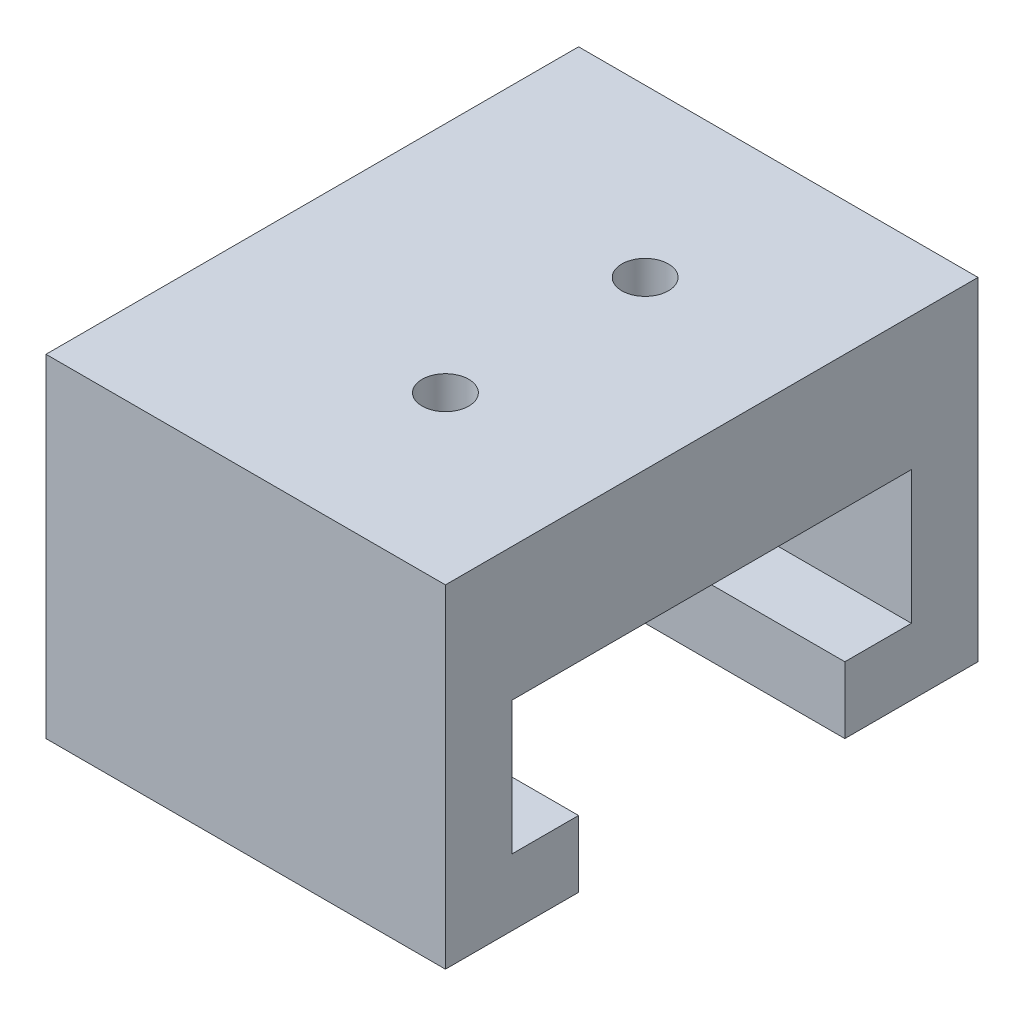
ISO-10303-21;
HEADER;
FILE_DESCRIPTION(('STEP AP214'),'2;1');
FILE_NAME('part.step','',(''),(''),'','','');
FILE_SCHEMA(('AUTOMOTIVE_DESIGN { 1 0 10303 214 1 1 1 1 }'));
ENDSEC;
DATA;
#1=APPLICATION_CONTEXT('core data for automotive mechanical design processes');
#2=APPLICATION_PROTOCOL_DEFINITION('international standard','automotive_design',2000,#1);
#3=PRODUCT_CONTEXT('',#1,'mechanical');
#4=PRODUCT('Part','Part','',(#3));
#5=PRODUCT_RELATED_PRODUCT_CATEGORY('part','',(#4));
#6=PRODUCT_DEFINITION_FORMATION('','',#4);
#7=PRODUCT_DEFINITION_CONTEXT('part definition',#1,'design');
#8=PRODUCT_DEFINITION('design','',#6,#7);
#9=PRODUCT_DEFINITION_SHAPE('','',#8);
#10=(LENGTH_UNIT() NAMED_UNIT(*) SI_UNIT(.MILLI.,.METRE.));
#11=(NAMED_UNIT(*) PLANE_ANGLE_UNIT() SI_UNIT($,.RADIAN.));
#12=(NAMED_UNIT(*) SI_UNIT($,.STERADIAN.) SOLID_ANGLE_UNIT());
#13=UNCERTAINTY_MEASURE_WITH_UNIT(LENGTH_MEASURE(1.E-05),#10,'distance_accuracy_value','');
#14=(GEOMETRIC_REPRESENTATION_CONTEXT(3) GLOBAL_UNCERTAINTY_ASSIGNED_CONTEXT((#13)) GLOBAL_UNIT_ASSIGNED_CONTEXT((#10,
#11,#12)) REPRESENTATION_CONTEXT('',''));
#15=CARTESIAN_POINT('',(0.,0.,0.));
#16=DIRECTION('',(0.,0.,1.));
#17=DIRECTION('',(1.,0.,0.));
#18=AXIS2_PLACEMENT_3D('',#15,#16,#17);
#19=CARTESIAN_POINT('',(-62.5,-133.,21.25));
#20=DIRECTION('',(0.,-1.,0.));
#21=DIRECTION('',(0.,0.,-1.));
#22=AXIS2_PLACEMENT_3D('',#19,#20,#21);
#23=CYLINDRICAL_SURFACE('',#22,1.75);
#24=CARTESIAN_POINT('',(-62.5,-150.,21.25));
#25=DIRECTION('',(0.,1.,0.));
#26=DIRECTION('',(0.,0.,1.));
#27=AXIS2_PLACEMENT_3D('',#24,#25,#26);
#28=CIRCLE('',#27,1.75);
#29=CARTESIAN_POINT('',(-62.5,-150.,23.));
#30=VERTEX_POINT('',#29);
#31=EDGE_CURVE('E160',#30,#30,#28,.T.);
#32=ORIENTED_EDGE('',*,*,#31,.T.);
#33=EDGE_LOOP('',(#32));
#34=FACE_BOUND('',#33,.T.);
#35=CARTESIAN_POINT('',(-62.5,-155.,21.25));
#36=DIRECTION('',(0.,-1.,0.));
#37=DIRECTION('',(0.,0.,-1.));
#38=AXIS2_PLACEMENT_3D('',#35,#36,#37);
#39=CIRCLE('',#38,1.75);
#40=CARTESIAN_POINT('',(-62.5,-155.,19.5));
#41=VERTEX_POINT('',#40);
#42=EDGE_CURVE('E47',#41,#41,#39,.F.);
#43=ORIENTED_EDGE('',*,*,#42,.F.);
#44=EDGE_LOOP('',(#43));
#45=FACE_BOUND('',#44,.T.);
#46=ADVANCED_FACE('F43',(#34,#45),#23,.F.);
#47=CARTESIAN_POINT('',(-62.5,-133.,36.2499999999999));
#48=DIRECTION('',(0.,-1.,0.));
#49=DIRECTION('',(0.,0.,-1.));
#50=AXIS2_PLACEMENT_3D('',#47,#48,#49);
#51=CYLINDRICAL_SURFACE('',#50,1.75);
#52=CARTESIAN_POINT('',(-62.5,-150.,36.2499999999999));
#53=DIRECTION('',(0.,1.,0.));
#54=DIRECTION('',(0.,0.,1.));
#55=AXIS2_PLACEMENT_3D('',#52,#53,#54);
#56=CIRCLE('',#55,1.75);
#57=CARTESIAN_POINT('',(-62.5,-150.,37.9999999999999));
#58=VERTEX_POINT('',#57);
#59=EDGE_CURVE('E177',#58,#58,#56,.T.);
#60=ORIENTED_EDGE('',*,*,#59,.T.);
#61=EDGE_LOOP('',(#60));
#62=FACE_BOUND('',#61,.T.);
#63=CARTESIAN_POINT('',(-62.5,-155.,36.2499999999999));
#64=DIRECTION('',(0.,-1.,0.));
#65=DIRECTION('',(0.,0.,-1.));
#66=AXIS2_PLACEMENT_3D('',#63,#64,#65);
#67=CIRCLE('',#66,1.75);
#68=CARTESIAN_POINT('',(-62.5,-155.,34.4999999999999));
#69=VERTEX_POINT('',#68);
#70=EDGE_CURVE('E154',#69,#69,#67,.F.);
#71=ORIENTED_EDGE('',*,*,#70,.F.);
#72=EDGE_LOOP('',(#71));
#73=FACE_BOUND('',#72,.T.);
#74=ADVANCED_FACE('F275',(#62,#73),#51,.F.);
#75=CARTESIAN_POINT('',(-75.,-150.,8.74999999999997));
#76=DIRECTION('',(0.,1.,0.));
#77=DIRECTION('',(0.,0.,1.));
#78=AXIS2_PLACEMENT_3D('',#75,#76,#77);
#79=PLANE('',#78);
#80=ORIENTED_EDGE('',*,*,#59,.F.);
#81=EDGE_LOOP('',(#80));
#82=FACE_BOUND('',#81,.T.);
#83=ORIENTED_EDGE('',*,*,#31,.F.);
#84=EDGE_LOOP('',(#83));
#85=FACE_BOUND('',#84,.T.);
#86=DIRECTION('',(0.,0.,1.));
#87=VECTOR('',#86,1.);
#88=CARTESIAN_POINT('',(-50.,-150.,8.74999999999997));
#89=LINE('',#88,#87);
#90=CARTESIAN_POINT('',(-50.,-150.,8.74999999999997));
#91=VERTEX_POINT('',#90);
#92=CARTESIAN_POINT('',(-50.,-150.,48.75));
#93=VERTEX_POINT('',#92);
#94=EDGE_CURVE('E190',#91,#93,#89,.T.);
#95=ORIENTED_EDGE('',*,*,#94,.F.);
#96=DIRECTION('',(1.,0.,0.));
#97=VECTOR('',#96,1.);
#98=CARTESIAN_POINT('',(-75.,-150.,8.74999999999997));
#99=LINE('',#98,#97);
#100=CARTESIAN_POINT('',(-80.,-150.,8.74999999999997));
#101=VERTEX_POINT('',#100);
#102=EDGE_CURVE('E11',#101,#91,#99,.T.);
#103=ORIENTED_EDGE('',*,*,#102,.F.);
#104=DIRECTION('',(0.,0.,-1.));
#105=VECTOR('',#104,1.);
#106=CARTESIAN_POINT('',(-80.,-150.,48.75));
#107=LINE('',#106,#105);
#108=CARTESIAN_POINT('',(-80.,-150.,48.75));
#109=VERTEX_POINT('',#108);
#110=EDGE_CURVE('E184',#109,#101,#107,.T.);
#111=ORIENTED_EDGE('',*,*,#110,.F.);
#112=DIRECTION('',(1.,0.,0.));
#113=VECTOR('',#112,1.);
#114=CARTESIAN_POINT('',(-75.,-150.,48.75));
#115=LINE('',#114,#113);
#116=EDGE_CURVE('E152',#109,#93,#115,.T.);
#117=ORIENTED_EDGE('',*,*,#116,.T.);
#118=EDGE_LOOP('',(#95,#103,#111,#117));
#119=FACE_BOUND('',#118,.T.);
#120=ADVANCED_FACE('F45',(#82,#85,#119),#79,.T.);
#121=CARTESIAN_POINT('',(-75.,-175.,8.74999999999997));
#122=DIRECTION('',(0.,0.,-1.));
#123=DIRECTION('',(-1.,0.,0.));
#124=AXIS2_PLACEMENT_3D('',#121,#122,#123);
#125=PLANE('',#124);
#126=DIRECTION('',(0.,1.,0.));
#127=VECTOR('',#126,1.);
#128=CARTESIAN_POINT('',(-50.,-175.,8.74999999999997));
#129=LINE('',#128,#127);
#130=CARTESIAN_POINT('',(-50.,-175.,8.74999999999997));
#131=VERTEX_POINT('',#130);
#132=EDGE_CURVE('E121',#131,#91,#129,.T.);
#133=ORIENTED_EDGE('',*,*,#132,.F.);
#134=DIRECTION('',(1.,0.,0.));
#135=VECTOR('',#134,1.);
#136=CARTESIAN_POINT('',(-75.,-175.,8.74999999999997));
#137=LINE('',#136,#135);
#138=CARTESIAN_POINT('',(-80.,-175.,8.74999999999997));
#139=VERTEX_POINT('',#138);
#140=EDGE_CURVE('E53',#139,#131,#137,.T.);
#141=ORIENTED_EDGE('',*,*,#140,.F.);
#142=DIRECTION('',(0.,-1.,0.));
#143=VECTOR('',#142,1.);
#144=CARTESIAN_POINT('',(-80.,-175.,8.74999999999997));
#145=LINE('',#144,#143);
#146=EDGE_CURVE('E187',#101,#139,#145,.T.);
#147=ORIENTED_EDGE('',*,*,#146,.F.);
#148=ORIENTED_EDGE('',*,*,#102,.T.);
#149=EDGE_LOOP('',(#133,#141,#147,#148));
#150=FACE_BOUND('',#149,.T.);
#151=ADVANCED_FACE('F126',(#150),#125,.T.);
#152=CARTESIAN_POINT('',(-75.,-175.,18.75));
#153=DIRECTION('',(0.,-1.,0.));
#154=DIRECTION('',(0.,0.,-1.));
#155=AXIS2_PLACEMENT_3D('',#152,#153,#154);
#156=PLANE('',#155);
#157=DIRECTION('',(0.,0.,-1.));
#158=VECTOR('',#157,1.);
#159=CARTESIAN_POINT('',(-50.,-175.,18.75));
#160=LINE('',#159,#158);
#161=CARTESIAN_POINT('',(-50.,-175.,18.75));
#162=VERTEX_POINT('',#161);
#163=EDGE_CURVE('E105',#162,#131,#160,.T.);
#164=ORIENTED_EDGE('',*,*,#163,.F.);
#165=DIRECTION('',(1.,0.,0.));
#166=VECTOR('',#165,1.);
#167=CARTESIAN_POINT('',(-75.,-175.,18.75));
#168=LINE('',#167,#166);
#169=CARTESIAN_POINT('',(-75.,-175.,18.75));
#170=VERTEX_POINT('',#169);
#171=EDGE_CURVE('E115',#170,#162,#168,.T.);
#172=ORIENTED_EDGE('',*,*,#171,.F.);
#173=DIRECTION('',(0.,0.,1.));
#174=VECTOR('',#173,1.);
#175=CARTESIAN_POINT('',(-75.,-175.,48.75));
#176=LINE('',#175,#174);
#177=CARTESIAN_POINT('',(-75.,-175.,38.75));
#178=VERTEX_POINT('',#177);
#179=EDGE_CURVE('E180',#170,#178,#176,.T.);
#180=ORIENTED_EDGE('',*,*,#179,.T.);
#181=DIRECTION('',(1.,0.,0.));
#182=VECTOR('',#181,1.);
#183=CARTESIAN_POINT('',(-75.,-175.,38.75));
#184=LINE('',#183,#182);
#185=CARTESIAN_POINT('',(-50.,-175.,38.75));
#186=VERTEX_POINT('',#185);
#187=EDGE_CURVE('E148',#178,#186,#184,.T.);
#188=ORIENTED_EDGE('',*,*,#187,.T.);
#189=DIRECTION('',(0.,0.,-1.));
#190=VECTOR('',#189,1.);
#191=CARTESIAN_POINT('',(-50.,-175.,48.75));
#192=LINE('',#191,#190);
#193=CARTESIAN_POINT('',(-50.,-175.,48.75));
#194=VERTEX_POINT('',#193);
#195=EDGE_CURVE('E212',#194,#186,#192,.T.);
#196=ORIENTED_EDGE('',*,*,#195,.F.);
#197=DIRECTION('',(1.,0.,0.));
#198=VECTOR('',#197,1.);
#199=CARTESIAN_POINT('',(-75.,-175.,48.75));
#200=LINE('',#199,#198);
#201=CARTESIAN_POINT('',(-80.,-175.,48.75));
#202=VERTEX_POINT('',#201);
#203=EDGE_CURVE('E150',#202,#194,#200,.T.);
#204=ORIENTED_EDGE('',*,*,#203,.F.);
#205=DIRECTION('',(0.,0.,1.));
#206=VECTOR('',#205,1.);
#207=CARTESIAN_POINT('',(-80.,-175.,48.75));
#208=LINE('',#207,#206);
#209=EDGE_CURVE('E110',#139,#202,#208,.T.);
#210=ORIENTED_EDGE('',*,*,#209,.F.);
#211=ORIENTED_EDGE('',*,*,#140,.T.);
#212=EDGE_LOOP('',(#164,#172,#180,#188,#196,#204,#210,#211));
#213=FACE_BOUND('',#212,.T.);
#214=ADVANCED_FACE('F103',(#213),#156,.T.);
#215=CARTESIAN_POINT('',(-75.,-170.,18.75));
#216=DIRECTION('',(0.,0.,1.));
#217=DIRECTION('',(1.,0.,0.));
#218=AXIS2_PLACEMENT_3D('',#215,#216,#217);
#219=PLANE('',#218);
#220=DIRECTION('',(0.,-1.,0.));
#221=VECTOR('',#220,1.);
#222=CARTESIAN_POINT('',(-50.,-170.,18.75));
#223=LINE('',#222,#221);
#224=CARTESIAN_POINT('',(-50.,-170.,18.75));
#225=VERTEX_POINT('',#224);
#226=EDGE_CURVE('E124',#225,#162,#223,.T.);
#227=ORIENTED_EDGE('',*,*,#226,.F.);
#228=DIRECTION('',(1.,0.,0.));
#229=VECTOR('',#228,1.);
#230=CARTESIAN_POINT('',(-75.,-170.,18.75));
#231=LINE('',#230,#229);
#232=CARTESIAN_POINT('',(-75.,-170.,18.75));
#233=VERTEX_POINT('',#232);
#234=EDGE_CURVE('E136',#233,#225,#231,.T.);
#235=ORIENTED_EDGE('',*,*,#234,.F.);
#236=DIRECTION('',(0.,-1.,0.));
#237=VECTOR('',#236,1.);
#238=CARTESIAN_POINT('',(-75.,-170.,18.75));
#239=LINE('',#238,#237);
#240=EDGE_CURVE('E153',#233,#170,#239,.T.);
#241=ORIENTED_EDGE('',*,*,#240,.T.);
#242=ORIENTED_EDGE('',*,*,#171,.T.);
#243=EDGE_LOOP('',(#227,#235,#241,#242));
#244=FACE_BOUND('',#243,.T.);
#245=ADVANCED_FACE('F240',(#244),#219,.T.);
#246=CARTESIAN_POINT('',(-75.,-170.,13.75));
#247=DIRECTION('',(0.,1.,0.));
#248=DIRECTION('',(0.,0.,1.));
#249=AXIS2_PLACEMENT_3D('',#246,#247,#248);
#250=PLANE('',#249);
#251=DIRECTION('',(0.,0.,1.));
#252=VECTOR('',#251,1.);
#253=CARTESIAN_POINT('',(-50.,-170.,13.75));
#254=LINE('',#253,#252);
#255=CARTESIAN_POINT('',(-50.,-170.,13.75));
#256=VERTEX_POINT('',#255);
#257=EDGE_CURVE('E230',#256,#225,#254,.T.);
#258=ORIENTED_EDGE('',*,*,#257,.F.);
#259=DIRECTION('',(1.,0.,0.));
#260=VECTOR('',#259,1.);
#261=CARTESIAN_POINT('',(-75.,-170.,13.75));
#262=LINE('',#261,#260);
#263=CARTESIAN_POINT('',(-75.,-170.,13.75));
#264=VERTEX_POINT('',#263);
#265=EDGE_CURVE('E138',#264,#256,#262,.T.);
#266=ORIENTED_EDGE('',*,*,#265,.F.);
#267=DIRECTION('',(0.,0.,1.));
#268=VECTOR('',#267,1.);
#269=CARTESIAN_POINT('',(-75.,-170.,13.75));
#270=LINE('',#269,#268);
#271=EDGE_CURVE('E203',#264,#233,#270,.T.);
#272=ORIENTED_EDGE('',*,*,#271,.T.);
#273=ORIENTED_EDGE('',*,*,#234,.T.);
#274=EDGE_LOOP('',(#258,#266,#272,#273));
#275=FACE_BOUND('',#274,.T.);
#276=ADVANCED_FACE('F235',(#275),#250,.T.);
#277=CARTESIAN_POINT('',(-75.,-160.,13.75));
#278=DIRECTION('',(0.,0.,1.));
#279=DIRECTION('',(0.,-1.,0.));
#280=AXIS2_PLACEMENT_3D('',#277,#278,#279);
#281=PLANE('',#280);
#282=DIRECTION('',(0.,-1.,0.));
#283=VECTOR('',#282,1.);
#284=CARTESIAN_POINT('',(-50.,-160.,13.75));
#285=LINE('',#284,#283);
#286=CARTESIAN_POINT('',(-50.,-160.,13.75));
#287=VERTEX_POINT('',#286);
#288=EDGE_CURVE('E227',#287,#256,#285,.T.);
#289=ORIENTED_EDGE('',*,*,#288,.F.);
#290=DIRECTION('',(1.,0.,0.));
#291=VECTOR('',#290,1.);
#292=CARTESIAN_POINT('',(-75.,-160.,13.75));
#293=LINE('',#292,#291);
#294=CARTESIAN_POINT('',(-75.,-160.,13.75));
#295=VERTEX_POINT('',#294);
#296=EDGE_CURVE('E140',#295,#287,#293,.T.);
#297=ORIENTED_EDGE('',*,*,#296,.F.);
#298=DIRECTION('',(0.,-1.,0.));
#299=VECTOR('',#298,1.);
#300=CARTESIAN_POINT('',(-75.,-160.,13.75));
#301=LINE('',#300,#299);
#302=EDGE_CURVE('E200',#295,#264,#301,.T.);
#303=ORIENTED_EDGE('',*,*,#302,.T.);
#304=ORIENTED_EDGE('',*,*,#265,.T.);
#305=EDGE_LOOP('',(#289,#297,#303,#304));
#306=FACE_BOUND('',#305,.T.);
#307=ADVANCED_FACE('F306',(#306),#281,.T.);
#308=CARTESIAN_POINT('',(-75.,-160.,43.75));
#309=DIRECTION('',(0.,-1.,0.));
#310=DIRECTION('',(0.,0.,-1.));
#311=AXIS2_PLACEMENT_3D('',#308,#309,#310);
#312=PLANE('',#311);
#313=CARTESIAN_POINT('',(-62.5,-160.,36.2499999999999));
#314=DIRECTION('',(0.,-1.,0.));
#315=DIRECTION('',(0.,0.,-1.));
#316=AXIS2_PLACEMENT_3D('',#313,#314,#315);
#317=CIRCLE('',#316,2.5);
#318=CARTESIAN_POINT('',(-62.5,-160.,33.7499999999999));
#319=VERTEX_POINT('',#318);
#320=EDGE_CURVE('E162',#319,#319,#317,.T.);
#321=ORIENTED_EDGE('',*,*,#320,.F.);
#322=EDGE_LOOP('',(#321));
#323=FACE_BOUND('',#322,.T.);
#324=CARTESIAN_POINT('',(-62.5,-160.,21.25));
#325=DIRECTION('',(0.,-1.,0.));
#326=DIRECTION('',(0.,0.,-1.));
#327=AXIS2_PLACEMENT_3D('',#324,#325,#326);
#328=CIRCLE('',#327,2.5);
#329=CARTESIAN_POINT('',(-62.5,-160.,18.75));
#330=VERTEX_POINT('',#329);
#331=EDGE_CURVE('E167',#330,#330,#328,.T.);
#332=ORIENTED_EDGE('',*,*,#331,.F.);
#333=EDGE_LOOP('',(#332));
#334=FACE_BOUND('',#333,.T.);
#335=DIRECTION('',(0.,0.,-1.));
#336=VECTOR('',#335,1.);
#337=CARTESIAN_POINT('',(-50.,-160.,43.75));
#338=LINE('',#337,#336);
#339=CARTESIAN_POINT('',(-50.,-160.,43.75));
#340=VERTEX_POINT('',#339);
#341=EDGE_CURVE('E224',#340,#287,#338,.T.);
#342=ORIENTED_EDGE('',*,*,#341,.F.);
#343=DIRECTION('',(1.,0.,0.));
#344=VECTOR('',#343,1.);
#345=CARTESIAN_POINT('',(-75.,-160.,43.75));
#346=LINE('',#345,#344);
#347=CARTESIAN_POINT('',(-75.,-160.,43.75));
#348=VERTEX_POINT('',#347);
#349=EDGE_CURVE('E142',#348,#340,#346,.T.);
#350=ORIENTED_EDGE('',*,*,#349,.F.);
#351=DIRECTION('',(0.,0.,-1.));
#352=VECTOR('',#351,1.);
#353=CARTESIAN_POINT('',(-75.,-160.,43.75));
#354=LINE('',#353,#352);
#355=EDGE_CURVE('E197',#348,#295,#354,.T.);
#356=ORIENTED_EDGE('',*,*,#355,.T.);
#357=ORIENTED_EDGE('',*,*,#296,.T.);
#358=EDGE_LOOP('',(#342,#350,#356,#357));
#359=FACE_BOUND('',#358,.T.);
#360=ADVANCED_FACE('F302',(#323,#334,#359),#312,.T.);
#361=CARTESIAN_POINT('',(-75.,-170.,43.75));
#362=DIRECTION('',(0.,0.,-1.));
#363=DIRECTION('',(-1.,0.,0.));
#364=AXIS2_PLACEMENT_3D('',#361,#362,#363);
#365=PLANE('',#364);
#366=DIRECTION('',(0.,1.,0.));
#367=VECTOR('',#366,1.);
#368=CARTESIAN_POINT('',(-50.,-170.,43.75));
#369=LINE('',#368,#367);
#370=CARTESIAN_POINT('',(-50.,-170.,43.75));
#371=VERTEX_POINT('',#370);
#372=EDGE_CURVE('E221',#371,#340,#369,.T.);
#373=ORIENTED_EDGE('',*,*,#372,.F.);
#374=DIRECTION('',(1.,0.,0.));
#375=VECTOR('',#374,1.);
#376=CARTESIAN_POINT('',(-75.,-170.,43.75));
#377=LINE('',#376,#375);
#378=CARTESIAN_POINT('',(-75.,-170.,43.75));
#379=VERTEX_POINT('',#378);
#380=EDGE_CURVE('E144',#379,#371,#377,.T.);
#381=ORIENTED_EDGE('',*,*,#380,.F.);
#382=DIRECTION('',(0.,1.,0.));
#383=VECTOR('',#382,1.);
#384=CARTESIAN_POINT('',(-75.,-170.,43.75));
#385=LINE('',#384,#383);
#386=EDGE_CURVE('E194',#379,#348,#385,.T.);
#387=ORIENTED_EDGE('',*,*,#386,.T.);
#388=ORIENTED_EDGE('',*,*,#349,.T.);
#389=EDGE_LOOP('',(#373,#381,#387,#388));
#390=FACE_BOUND('',#389,.T.);
#391=ADVANCED_FACE('F305',(#390),#365,.T.);
#392=CARTESIAN_POINT('',(-75.,-170.,38.75));
#393=DIRECTION('',(0.,1.,0.));
#394=DIRECTION('',(0.,0.,1.));
#395=AXIS2_PLACEMENT_3D('',#392,#393,#394);
#396=PLANE('',#395);
#397=DIRECTION('',(0.,0.,1.));
#398=VECTOR('',#397,1.);
#399=CARTESIAN_POINT('',(-50.,-170.,38.75));
#400=LINE('',#399,#398);
#401=CARTESIAN_POINT('',(-50.,-170.,38.75));
#402=VERTEX_POINT('',#401);
#403=EDGE_CURVE('E218',#402,#371,#400,.T.);
#404=ORIENTED_EDGE('',*,*,#403,.F.);
#405=DIRECTION('',(1.,0.,0.));
#406=VECTOR('',#405,1.);
#407=CARTESIAN_POINT('',(-75.,-170.,38.75));
#408=LINE('',#407,#406);
#409=CARTESIAN_POINT('',(-75.,-170.,38.75));
#410=VERTEX_POINT('',#409);
#411=EDGE_CURVE('E146',#410,#402,#408,.T.);
#412=ORIENTED_EDGE('',*,*,#411,.F.);
#413=DIRECTION('',(0.,0.,1.));
#414=VECTOR('',#413,1.);
#415=CARTESIAN_POINT('',(-75.,-170.,38.75));
#416=LINE('',#415,#414);
#417=EDGE_CURVE('E61',#410,#379,#416,.T.);
#418=ORIENTED_EDGE('',*,*,#417,.T.);
#419=ORIENTED_EDGE('',*,*,#380,.T.);
#420=EDGE_LOOP('',(#404,#412,#418,#419));
#421=FACE_BOUND('',#420,.T.);
#422=ADVANCED_FACE('F329',(#421),#396,.T.);
#423=CARTESIAN_POINT('',(-75.,-175.,38.75));
#424=DIRECTION('',(0.,0.,-1.));
#425=DIRECTION('',(-1.,0.,0.));
#426=AXIS2_PLACEMENT_3D('',#423,#424,#425);
#427=PLANE('',#426);
#428=DIRECTION('',(0.,1.,0.));
#429=VECTOR('',#428,1.);
#430=CARTESIAN_POINT('',(-50.,-175.,38.75));
#431=LINE('',#430,#429);
#432=EDGE_CURVE('E215',#186,#402,#431,.T.);
#433=ORIENTED_EDGE('',*,*,#432,.F.);
#434=ORIENTED_EDGE('',*,*,#187,.F.);
#435=DIRECTION('',(0.,1.,0.));
#436=VECTOR('',#435,1.);
#437=CARTESIAN_POINT('',(-75.,-175.,38.75));
#438=LINE('',#437,#436);
#439=EDGE_CURVE('E129',#178,#410,#438,.T.);
#440=ORIENTED_EDGE('',*,*,#439,.T.);
#441=ORIENTED_EDGE('',*,*,#411,.T.);
#442=EDGE_LOOP('',(#433,#434,#440,#441));
#443=FACE_BOUND('',#442,.T.);
#444=ADVANCED_FACE('F332',(#443),#427,.T.);
#445=CARTESIAN_POINT('',(-75.,-150.,48.75));
#446=DIRECTION('',(0.,0.,1.));
#447=DIRECTION('',(1.,0.,0.));
#448=AXIS2_PLACEMENT_3D('',#445,#446,#447);
#449=PLANE('',#448);
#450=DIRECTION('',(0.,-1.,0.));
#451=VECTOR('',#450,1.);
#452=CARTESIAN_POINT('',(-50.,-150.,48.75));
#453=LINE('',#452,#451);
#454=EDGE_CURVE('E209',#93,#194,#453,.T.);
#455=ORIENTED_EDGE('',*,*,#454,.F.);
#456=ORIENTED_EDGE('',*,*,#116,.F.);
#457=DIRECTION('',(0.,1.,0.));
#458=VECTOR('',#457,1.);
#459=CARTESIAN_POINT('',(-80.,-175.,48.75));
#460=LINE('',#459,#458);
#461=EDGE_CURVE('E181',#202,#109,#460,.T.);
#462=ORIENTED_EDGE('',*,*,#461,.F.);
#463=ORIENTED_EDGE('',*,*,#203,.T.);
#464=EDGE_LOOP('',(#455,#456,#462,#463));
#465=FACE_BOUND('',#464,.T.);
#466=ADVANCED_FACE('F335',(#465),#449,.T.);
#467=CARTESIAN_POINT('',(-50.,0.,0.));
#468=DIRECTION('',(1.,0.,0.));
#469=DIRECTION('',(0.,0.,-1.));
#470=AXIS2_PLACEMENT_3D('',#467,#468,#469);
#471=PLANE('',#470);
#472=ORIENTED_EDGE('',*,*,#94,.T.);
#473=ORIENTED_EDGE('',*,*,#454,.T.);
#474=ORIENTED_EDGE('',*,*,#195,.T.);
#475=ORIENTED_EDGE('',*,*,#432,.T.);
#476=ORIENTED_EDGE('',*,*,#403,.T.);
#477=ORIENTED_EDGE('',*,*,#372,.T.);
#478=ORIENTED_EDGE('',*,*,#341,.T.);
#479=ORIENTED_EDGE('',*,*,#288,.T.);
#480=ORIENTED_EDGE('',*,*,#257,.T.);
#481=ORIENTED_EDGE('',*,*,#226,.T.);
#482=ORIENTED_EDGE('',*,*,#163,.T.);
#483=ORIENTED_EDGE('',*,*,#132,.T.);
#484=EDGE_LOOP('',(#472,#473,#474,#475,#476,#477,#478,#479,#480,#481,#482,#483));
#485=FACE_BOUND('',#484,.T.);
#486=ADVANCED_FACE('F120',(#485),#471,.T.);
#487=CARTESIAN_POINT('',(-80.,0.,0.));
#488=DIRECTION('',(-1.,0.,0.));
#489=DIRECTION('',(0.,0.,1.));
#490=AXIS2_PLACEMENT_3D('',#487,#488,#489);
#491=PLANE('',#490);
#492=ORIENTED_EDGE('',*,*,#461,.T.);
#493=ORIENTED_EDGE('',*,*,#110,.T.);
#494=ORIENTED_EDGE('',*,*,#146,.T.);
#495=ORIENTED_EDGE('',*,*,#209,.T.);
#496=EDGE_LOOP('',(#492,#493,#494,#495));
#497=FACE_BOUND('',#496,.T.);
#498=ADVANCED_FACE('F262',(#497),#491,.T.);
#499=CARTESIAN_POINT('',(-75.,0.,0.));
#500=DIRECTION('',(-1.,0.,0.));
#501=DIRECTION('',(0.,0.,1.));
#502=AXIS2_PLACEMENT_3D('',#499,#500,#501);
#503=PLANE('',#502);
#504=ORIENTED_EDGE('',*,*,#240,.F.);
#505=ORIENTED_EDGE('',*,*,#271,.F.);
#506=ORIENTED_EDGE('',*,*,#302,.F.);
#507=ORIENTED_EDGE('',*,*,#355,.F.);
#508=ORIENTED_EDGE('',*,*,#386,.F.);
#509=ORIENTED_EDGE('',*,*,#417,.F.);
#510=ORIENTED_EDGE('',*,*,#439,.F.);
#511=ORIENTED_EDGE('',*,*,#179,.F.);
#512=EDGE_LOOP('',(#504,#505,#506,#507,#508,#509,#510,#511));
#513=FACE_BOUND('',#512,.T.);
#514=ADVANCED_FACE('F259',(#513),#503,.F.);
#515=CARTESIAN_POINT('',(-62.5,-155.,36.2499999999999));
#516=DIRECTION('',(0.,-1.,0.));
#517=DIRECTION('',(0.,0.,-1.));
#518=AXIS2_PLACEMENT_3D('',#515,#516,#517);
#519=PLANE('',#518);
#520=CARTESIAN_POINT('',(-62.5,-155.,36.2499999999999));
#521=DIRECTION('',(0.,-1.,0.));
#522=DIRECTION('',(0.,0.,-1.));
#523=AXIS2_PLACEMENT_3D('',#520,#521,#522);
#524=CIRCLE('',#523,2.5);
#525=CARTESIAN_POINT('',(-62.5,-155.,33.7499999999999));
#526=VERTEX_POINT('',#525);
#527=EDGE_CURVE('E156',#526,#526,#524,.T.);
#528=ORIENTED_EDGE('',*,*,#527,.T.);
#529=EDGE_LOOP('',(#528));
#530=FACE_BOUND('',#529,.T.);
#531=ORIENTED_EDGE('',*,*,#70,.T.);
#532=EDGE_LOOP('',(#531));
#533=FACE_BOUND('',#532,.T.);
#534=ADVANCED_FACE('F261',(#530,#533),#519,.T.);
#535=CARTESIAN_POINT('',(-62.5,-155.,36.2499999999999));
#536=DIRECTION('',(0.,-1.,0.));
#537=DIRECTION('',(0.,0.,-1.));
#538=AXIS2_PLACEMENT_3D('',#535,#536,#537);
#539=CYLINDRICAL_SURFACE('',#538,2.5);
#540=ORIENTED_EDGE('',*,*,#527,.F.);
#541=EDGE_LOOP('',(#540));
#542=FACE_BOUND('',#541,.T.);
#543=ORIENTED_EDGE('',*,*,#320,.T.);
#544=EDGE_LOOP('',(#543));
#545=FACE_BOUND('',#544,.T.);
#546=ADVANCED_FACE('F269',(#542,#545),#539,.F.);
#547=CARTESIAN_POINT('',(-62.5,-155.,21.25));
#548=DIRECTION('',(0.,-1.,0.));
#549=DIRECTION('',(0.,0.,-1.));
#550=AXIS2_PLACEMENT_3D('',#547,#548,#549);
#551=PLANE('',#550);
#552=CARTESIAN_POINT('',(-62.5,-155.,21.25));
#553=DIRECTION('',(0.,-1.,0.));
#554=DIRECTION('',(0.,0.,-1.));
#555=AXIS2_PLACEMENT_3D('',#552,#553,#554);
#556=CIRCLE('',#555,2.5);
#557=CARTESIAN_POINT('',(-62.5,-155.,18.75));
#558=VERTEX_POINT('',#557);
#559=EDGE_CURVE('E172',#558,#558,#556,.T.);
#560=ORIENTED_EDGE('',*,*,#559,.T.);
#561=EDGE_LOOP('',(#560));
#562=FACE_BOUND('',#561,.T.);
#563=ORIENTED_EDGE('',*,*,#42,.T.);
#564=EDGE_LOOP('',(#563));
#565=FACE_BOUND('',#564,.T.);
#566=ADVANCED_FACE('F286',(#562,#565),#551,.T.);
#567=CARTESIAN_POINT('',(-62.5,-155.,21.25));
#568=DIRECTION('',(0.,-1.,0.));
#569=DIRECTION('',(0.,0.,-1.));
#570=AXIS2_PLACEMENT_3D('',#567,#568,#569);
#571=CYLINDRICAL_SURFACE('',#570,2.5);
#572=ORIENTED_EDGE('',*,*,#559,.F.);
#573=EDGE_LOOP('',(#572));
#574=FACE_BOUND('',#573,.T.);
#575=ORIENTED_EDGE('',*,*,#331,.T.);
#576=EDGE_LOOP('',(#575));
#577=FACE_BOUND('',#576,.T.);
#578=ADVANCED_FACE('F289',(#574,#577),#571,.F.);
#579=CLOSED_SHELL('',(#46,#74,#120,#151,#214,#245,#276,#307,#360,#391,#422,#444,#466,#486,#498,
#514,#534,#546,#566,#578));
#580=MANIFOLD_SOLID_BREP('B2',#579);
#581=ADVANCED_BREP_SHAPE_REPRESENTATION('',(#18,#580),#14);
#582=SHAPE_DEFINITION_REPRESENTATION(#9,#581);
ENDSEC;
END-ISO-10303-21;
